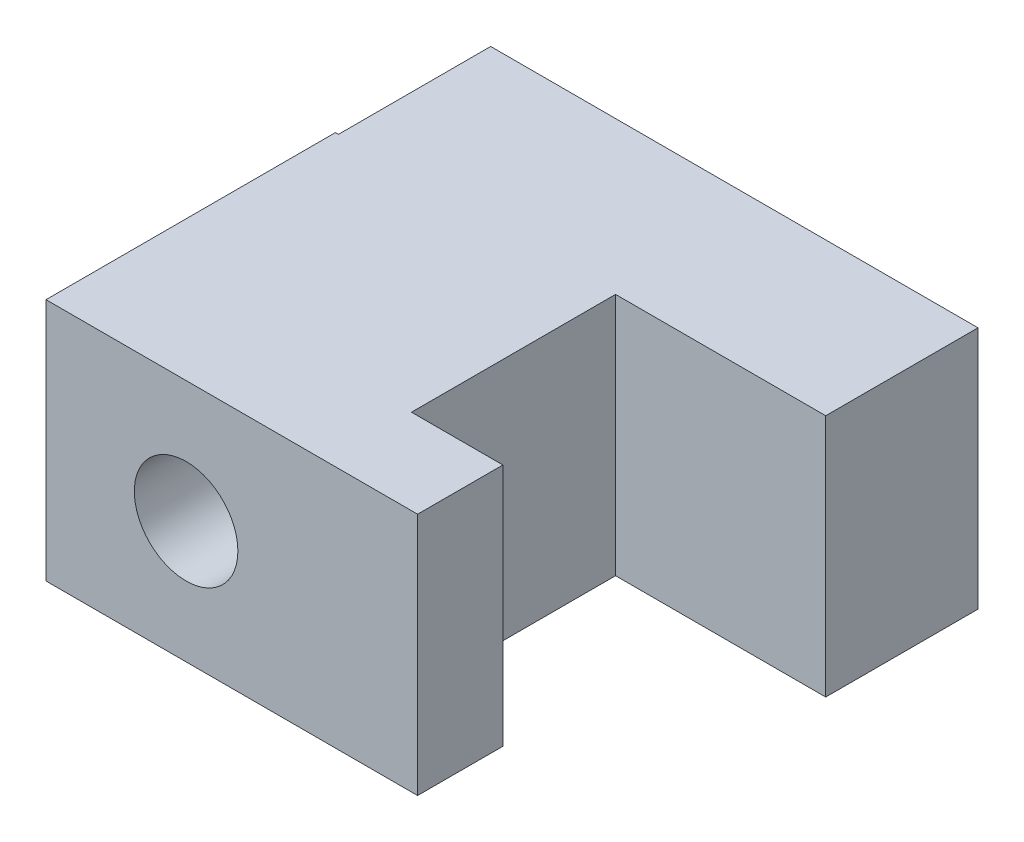
ISO-10303-21;
HEADER;
FILE_DESCRIPTION(('STEP AP214'),'2;1');
FILE_NAME('part.step','',(''),(''),'','','');
FILE_SCHEMA(('AUTOMOTIVE_DESIGN { 1 0 10303 214 1 1 1 1 }'));
ENDSEC;
DATA;
#1=APPLICATION_CONTEXT('core data for automotive mechanical design processes');
#2=APPLICATION_PROTOCOL_DEFINITION('international standard','automotive_design',2000,#1);
#3=PRODUCT_CONTEXT('',#1,'mechanical');
#4=PRODUCT('Part','Part','',(#3));
#5=PRODUCT_RELATED_PRODUCT_CATEGORY('part','',(#4));
#6=PRODUCT_DEFINITION_FORMATION('','',#4);
#7=PRODUCT_DEFINITION_CONTEXT('part definition',#1,'design');
#8=PRODUCT_DEFINITION('design','',#6,#7);
#9=PRODUCT_DEFINITION_SHAPE('','',#8);
#10=(LENGTH_UNIT() NAMED_UNIT(*) SI_UNIT(.MILLI.,.METRE.));
#11=(NAMED_UNIT(*) PLANE_ANGLE_UNIT() SI_UNIT($,.RADIAN.));
#12=(NAMED_UNIT(*) SI_UNIT($,.STERADIAN.) SOLID_ANGLE_UNIT());
#13=UNCERTAINTY_MEASURE_WITH_UNIT(LENGTH_MEASURE(1.E-05),#10,'distance_accuracy_value','');
#14=(GEOMETRIC_REPRESENTATION_CONTEXT(3) GLOBAL_UNCERTAINTY_ASSIGNED_CONTEXT((#13)) GLOBAL_UNIT_ASSIGNED_CONTEXT((#10,
#11,#12)) REPRESENTATION_CONTEXT('',''));
#15=CARTESIAN_POINT('',(0.,0.,0.));
#16=DIRECTION('',(0.,0.,1.));
#17=DIRECTION('',(1.,0.,0.));
#18=AXIS2_PLACEMENT_3D('',#15,#16,#17);
#19=CARTESIAN_POINT('',(-4.5,-4.,5.));
#20=DIRECTION('',(0.,1.,0.));
#21=DIRECTION('',(0.,0.,1.));
#22=AXIS2_PLACEMENT_3D('',#19,#20,#21);
#23=PLANE('',#22);
#24=DIRECTION('',(1.,0.,0.));
#25=VECTOR('',#24,1.);
#26=CARTESIAN_POINT('',(-4.5,-4.,0.));
#27=LINE('',#26,#25);
#28=CARTESIAN_POINT('',(-4.5,-4.,0.));
#29=VERTEX_POINT('',#28);
#30=CARTESIAN_POINT('',(11.5,-4.,0.));
#31=VERTEX_POINT('',#30);
#32=EDGE_CURVE('E179',#29,#31,#27,.T.);
#33=ORIENTED_EDGE('',*,*,#32,.T.);
#34=DIRECTION('',(0.,0.,-1.));
#35=VECTOR('',#34,1.);
#36=CARTESIAN_POINT('',(11.5,-4.,5.));
#37=LINE('',#36,#35);
#38=CARTESIAN_POINT('',(11.5,-4.,5.));
#39=VERTEX_POINT('',#38);
#40=EDGE_CURVE('E11',#39,#31,#37,.T.);
#41=ORIENTED_EDGE('',*,*,#40,.F.);
#42=DIRECTION('',(1.,0.,0.));
#43=VECTOR('',#42,1.);
#44=CARTESIAN_POINT('',(-4.5,-4.,5.));
#45=LINE('',#44,#43);
#46=CARTESIAN_POINT('',(4.6,-4.,5.));
#47=VERTEX_POINT('',#46);
#48=EDGE_CURVE('E90',#47,#39,#45,.T.);
#49=ORIENTED_EDGE('',*,*,#48,.F.);
#50=DIRECTION('',(0.,0.,-1.));
#51=VECTOR('',#50,1.);
#52=CARTESIAN_POINT('',(4.6,-4.,11.7));
#53=LINE('',#52,#51);
#54=CARTESIAN_POINT('',(4.6,-4.,11.7));
#55=VERTEX_POINT('',#54);
#56=EDGE_CURVE('E176',#55,#47,#53,.T.);
#57=ORIENTED_EDGE('',*,*,#56,.F.);
#58=DIRECTION('',(1.,0.,0.));
#59=VECTOR('',#58,1.);
#60=CARTESIAN_POINT('',(-4.6,-4.,11.7));
#61=LINE('',#60,#59);
#62=CARTESIAN_POINT('',(7.6,-4.,11.7));
#63=VERTEX_POINT('',#62);
#64=EDGE_CURVE('E151',#55,#63,#61,.T.);
#65=ORIENTED_EDGE('',*,*,#64,.T.);
#66=DIRECTION('',(0.,0.,-1.));
#67=VECTOR('',#66,1.);
#68=CARTESIAN_POINT('',(7.6,-4.,14.5));
#69=LINE('',#68,#67);
#70=CARTESIAN_POINT('',(7.6,-4.,14.5));
#71=VERTEX_POINT('',#70);
#72=EDGE_CURVE('E130',#71,#63,#69,.T.);
#73=ORIENTED_EDGE('',*,*,#72,.F.);
#74=DIRECTION('',(1.,0.,0.));
#75=VECTOR('',#74,1.);
#76=CARTESIAN_POINT('',(-4.6,-4.,14.5));
#77=LINE('',#76,#75);
#78=CARTESIAN_POINT('',(-4.6,-4.,14.5));
#79=VERTEX_POINT('',#78);
#80=EDGE_CURVE('E137',#79,#71,#77,.T.);
#81=ORIENTED_EDGE('',*,*,#80,.F.);
#82=DIRECTION('',(0.,0.,-1.));
#83=VECTOR('',#82,1.);
#84=CARTESIAN_POINT('',(-4.6,-4.,11.7));
#85=LINE('',#84,#83);
#86=CARTESIAN_POINT('',(-4.6,-4.,5.));
#87=VERTEX_POINT('',#86);
#88=EDGE_CURVE('E162',#79,#87,#85,.T.);
#89=ORIENTED_EDGE('',*,*,#88,.T.);
#90=DIRECTION('',(1.,0.,0.));
#91=VECTOR('',#90,1.);
#92=CARTESIAN_POINT('',(-4.6,-4.,5.));
#93=LINE('',#92,#91);
#94=CARTESIAN_POINT('',(-4.5,-4.,5.));
#95=VERTEX_POINT('',#94);
#96=EDGE_CURVE('E153',#87,#95,#93,.T.);
#97=ORIENTED_EDGE('',*,*,#96,.T.);
#98=DIRECTION('',(0.,0.,-1.));
#99=VECTOR('',#98,1.);
#100=CARTESIAN_POINT('',(-4.5,-4.,5.));
#101=LINE('',#100,#99);
#102=EDGE_CURVE('E67',#95,#29,#101,.T.);
#103=ORIENTED_EDGE('',*,*,#102,.T.);
#104=EDGE_LOOP('',(#33,#41,#49,#57,#65,#73,#81,#89,#97,#103));
#105=FACE_BOUND('',#104,.T.);
#106=ADVANCED_FACE('F43',(#105),#23,.F.);
#107=CARTESIAN_POINT('',(11.5,-4.,5.));
#108=DIRECTION('',(-1.,0.,0.));
#109=DIRECTION('',(0.,0.,1.));
#110=AXIS2_PLACEMENT_3D('',#107,#108,#109);
#111=PLANE('',#110);
#112=DIRECTION('',(0.,1.,0.));
#113=VECTOR('',#112,1.);
#114=CARTESIAN_POINT('',(11.5,-4.,0.));
#115=LINE('',#114,#113);
#116=CARTESIAN_POINT('',(11.5,4.,0.));
#117=VERTEX_POINT('',#116);
#118=EDGE_CURVE('E188',#31,#117,#115,.T.);
#119=ORIENTED_EDGE('',*,*,#118,.T.);
#120=DIRECTION('',(0.,0.,-1.));
#121=VECTOR('',#120,1.);
#122=CARTESIAN_POINT('',(11.5,4.,5.));
#123=LINE('',#122,#121);
#124=CARTESIAN_POINT('',(11.5,4.,5.));
#125=VERTEX_POINT('',#124);
#126=EDGE_CURVE('E51',#125,#117,#123,.T.);
#127=ORIENTED_EDGE('',*,*,#126,.F.);
#128=DIRECTION('',(0.,1.,0.));
#129=VECTOR('',#128,1.);
#130=CARTESIAN_POINT('',(11.5,-4.,5.));
#131=LINE('',#130,#129);
#132=EDGE_CURVE('E181',#39,#125,#131,.T.);
#133=ORIENTED_EDGE('',*,*,#132,.F.);
#134=ORIENTED_EDGE('',*,*,#40,.T.);
#135=EDGE_LOOP('',(#119,#127,#133,#134));
#136=FACE_BOUND('',#135,.T.);
#137=ADVANCED_FACE('F238',(#136),#111,.F.);
#138=CARTESIAN_POINT('',(11.5,4.,5.));
#139=DIRECTION('',(0.,-1.,0.));
#140=DIRECTION('',(0.,0.,-1.));
#141=AXIS2_PLACEMENT_3D('',#138,#139,#140);
#142=PLANE('',#141);
#143=DIRECTION('',(-1.,0.,0.));
#144=VECTOR('',#143,1.);
#145=CARTESIAN_POINT('',(11.5,4.,0.));
#146=LINE('',#145,#144);
#147=CARTESIAN_POINT('',(-4.5,4.,0.));
#148=VERTEX_POINT('',#147);
#149=EDGE_CURVE('E190',#117,#148,#146,.T.);
#150=ORIENTED_EDGE('',*,*,#149,.T.);
#151=DIRECTION('',(0.,0.,-1.));
#152=VECTOR('',#151,1.);
#153=CARTESIAN_POINT('',(-4.5,4.,5.));
#154=LINE('',#153,#152);
#155=CARTESIAN_POINT('',(-4.5,4.,5.));
#156=VERTEX_POINT('',#155);
#157=EDGE_CURVE('E194',#156,#148,#154,.T.);
#158=ORIENTED_EDGE('',*,*,#157,.F.);
#159=DIRECTION('',(-1.,0.,0.));
#160=VECTOR('',#159,1.);
#161=CARTESIAN_POINT('',(4.6,4.,5.));
#162=LINE('',#161,#160);
#163=CARTESIAN_POINT('',(-4.6,4.,5.));
#164=VERTEX_POINT('',#163);
#165=EDGE_CURVE('E166',#156,#164,#162,.T.);
#166=ORIENTED_EDGE('',*,*,#165,.T.);
#167=DIRECTION('',(0.,0.,-1.));
#168=VECTOR('',#167,1.);
#169=CARTESIAN_POINT('',(-4.6,4.,11.7));
#170=LINE('',#169,#168);
#171=CARTESIAN_POINT('',(-4.6,4.,14.5));
#172=VERTEX_POINT('',#171);
#173=EDGE_CURVE('E170',#172,#164,#170,.T.);
#174=ORIENTED_EDGE('',*,*,#173,.F.);
#175=DIRECTION('',(-1.,0.,0.));
#176=VECTOR('',#175,1.);
#177=CARTESIAN_POINT('',(7.6,4.,14.5));
#178=LINE('',#177,#176);
#179=CARTESIAN_POINT('',(7.6,4.,14.5));
#180=VERTEX_POINT('',#179);
#181=EDGE_CURVE('E136',#180,#172,#178,.T.);
#182=ORIENTED_EDGE('',*,*,#181,.F.);
#183=DIRECTION('',(0.,0.,-1.));
#184=VECTOR('',#183,1.);
#185=CARTESIAN_POINT('',(7.6,4.,14.5));
#186=LINE('',#185,#184);
#187=CARTESIAN_POINT('',(7.6,4.,11.7));
#188=VERTEX_POINT('',#187);
#189=EDGE_CURVE('E132',#180,#188,#186,.T.);
#190=ORIENTED_EDGE('',*,*,#189,.T.);
#191=DIRECTION('',(-1.,0.,0.));
#192=VECTOR('',#191,1.);
#193=CARTESIAN_POINT('',(7.6,4.,11.7));
#194=LINE('',#193,#192);
#195=CARTESIAN_POINT('',(4.6,4.,11.7));
#196=VERTEX_POINT('',#195);
#197=EDGE_CURVE('E146',#188,#196,#194,.T.);
#198=ORIENTED_EDGE('',*,*,#197,.T.);
#199=DIRECTION('',(0.,0.,-1.));
#200=VECTOR('',#199,1.);
#201=CARTESIAN_POINT('',(4.6,4.,11.7));
#202=LINE('',#201,#200);
#203=CARTESIAN_POINT('',(4.6,4.,5.));
#204=VERTEX_POINT('',#203);
#205=EDGE_CURVE('E173',#196,#204,#202,.T.);
#206=ORIENTED_EDGE('',*,*,#205,.T.);
#207=DIRECTION('',(-1.,0.,0.));
#208=VECTOR('',#207,1.);
#209=CARTESIAN_POINT('',(11.5,4.,5.));
#210=LINE('',#209,#208);
#211=EDGE_CURVE('E183',#125,#204,#210,.T.);
#212=ORIENTED_EDGE('',*,*,#211,.F.);
#213=ORIENTED_EDGE('',*,*,#126,.T.);
#214=EDGE_LOOP('',(#150,#158,#166,#174,#182,#190,#198,#206,#212,#213));
#215=FACE_BOUND('',#214,.T.);
#216=ADVANCED_FACE('F201',(#215),#142,.F.);
#217=CARTESIAN_POINT('',(-4.5,4.,5.));
#218=DIRECTION('',(1.,0.,0.));
#219=DIRECTION('',(0.,0.,-1.));
#220=AXIS2_PLACEMENT_3D('',#217,#218,#219);
#221=PLANE('',#220);
#222=DIRECTION('',(0.,-1.,0.));
#223=VECTOR('',#222,1.);
#224=CARTESIAN_POINT('',(-4.5,4.,0.));
#225=LINE('',#224,#223);
#226=EDGE_CURVE('E87',#148,#29,#225,.T.);
#227=ORIENTED_EDGE('',*,*,#226,.T.);
#228=ORIENTED_EDGE('',*,*,#102,.F.);
#229=DIRECTION('',(0.,-1.,0.));
#230=VECTOR('',#229,1.);
#231=CARTESIAN_POINT('',(-4.5,4.,5.));
#232=LINE('',#231,#230);
#233=EDGE_CURVE('E185',#156,#95,#232,.T.);
#234=ORIENTED_EDGE('',*,*,#233,.F.);
#235=ORIENTED_EDGE('',*,*,#157,.T.);
#236=EDGE_LOOP('',(#227,#228,#234,#235));
#237=FACE_BOUND('',#236,.T.);
#238=ADVANCED_FACE('F212',(#237),#221,.F.);
#239=CARTESIAN_POINT('',(0.,0.,5.));
#240=DIRECTION('',(0.,0.,1.));
#241=DIRECTION('',(1.,0.,0.));
#242=AXIS2_PLACEMENT_3D('',#239,#240,#241);
#243=PLANE('',#242);
#244=DIRECTION('',(0.,1.,0.));
#245=VECTOR('',#244,1.);
#246=CARTESIAN_POINT('',(4.6,-4.,5.));
#247=LINE('',#246,#245);
#248=EDGE_CURVE('E58',#47,#204,#247,.T.);
#249=ORIENTED_EDGE('',*,*,#248,.F.);
#250=ORIENTED_EDGE('',*,*,#48,.T.);
#251=ORIENTED_EDGE('',*,*,#132,.T.);
#252=ORIENTED_EDGE('',*,*,#211,.T.);
#253=EDGE_LOOP('',(#249,#250,#251,#252));
#254=FACE_BOUND('',#253,.T.);
#255=ADVANCED_FACE('F248',(#254),#243,.T.);
#256=CARTESIAN_POINT('',(0.,0.,0.));
#257=DIRECTION('',(0.,0.,1.));
#258=DIRECTION('',(1.,0.,0.));
#259=AXIS2_PLACEMENT_3D('',#256,#257,#258);
#260=PLANE('',#259);
#261=CARTESIAN_POINT('',(0.,0.,0.));
#262=DIRECTION('',(0.,0.,1.));
#263=DIRECTION('',(1.,0.,0.));
#264=AXIS2_PLACEMENT_3D('',#261,#262,#263);
#265=CIRCLE('',#264,1.7);
#266=CARTESIAN_POINT('',(1.7,0.,0.));
#267=VERTEX_POINT('',#266);
#268=EDGE_CURVE('E220',#267,#267,#265,.F.);
#269=ORIENTED_EDGE('',*,*,#268,.F.);
#270=EDGE_LOOP('',(#269));
#271=FACE_BOUND('',#270,.T.);
#272=ORIENTED_EDGE('',*,*,#32,.F.);
#273=ORIENTED_EDGE('',*,*,#226,.F.);
#274=ORIENTED_EDGE('',*,*,#149,.F.);
#275=ORIENTED_EDGE('',*,*,#118,.F.);
#276=EDGE_LOOP('',(#272,#273,#274,#275));
#277=FACE_BOUND('',#276,.T.);
#278=ADVANCED_FACE('F205',(#271,#277),#260,.F.);
#279=CARTESIAN_POINT('',(0.,0.,5.));
#280=DIRECTION('',(0.,0.,1.));
#281=DIRECTION('',(1.,0.,0.));
#282=AXIS2_PLACEMENT_3D('',#279,#280,#281);
#283=PLANE('',#282);
#284=ORIENTED_EDGE('',*,*,#165,.F.);
#285=ORIENTED_EDGE('',*,*,#233,.T.);
#286=ORIENTED_EDGE('',*,*,#96,.F.);
#287=DIRECTION('',(0.,-1.,0.));
#288=VECTOR('',#287,1.);
#289=CARTESIAN_POINT('',(-4.6,4.,5.));
#290=LINE('',#289,#288);
#291=EDGE_CURVE('E163',#164,#87,#290,.T.);
#292=ORIENTED_EDGE('',*,*,#291,.F.);
#293=EDGE_LOOP('',(#284,#285,#286,#292));
#294=FACE_BOUND('',#293,.T.);
#295=ADVANCED_FACE('F211',(#294),#283,.F.);
#296=CARTESIAN_POINT('',(4.6,-4.,11.7));
#297=DIRECTION('',(-1.,0.,0.));
#298=DIRECTION('',(0.,0.,1.));
#299=AXIS2_PLACEMENT_3D('',#296,#297,#298);
#300=PLANE('',#299);
#301=ORIENTED_EDGE('',*,*,#248,.T.);
#302=ORIENTED_EDGE('',*,*,#205,.F.);
#303=DIRECTION('',(0.,1.,0.));
#304=VECTOR('',#303,1.);
#305=CARTESIAN_POINT('',(4.6,-4.,11.7));
#306=LINE('',#305,#304);
#307=EDGE_CURVE('E160',#55,#196,#306,.T.);
#308=ORIENTED_EDGE('',*,*,#307,.F.);
#309=ORIENTED_EDGE('',*,*,#56,.T.);
#310=EDGE_LOOP('',(#301,#302,#308,#309));
#311=FACE_BOUND('',#310,.T.);
#312=ADVANCED_FACE('F226',(#311),#300,.F.);
#313=CARTESIAN_POINT('',(-4.6,4.,11.7));
#314=DIRECTION('',(1.,0.,0.));
#315=DIRECTION('',(0.,0.,-1.));
#316=AXIS2_PLACEMENT_3D('',#313,#314,#315);
#317=PLANE('',#316);
#318=ORIENTED_EDGE('',*,*,#291,.T.);
#319=ORIENTED_EDGE('',*,*,#88,.F.);
#320=DIRECTION('',(0.,-1.,0.));
#321=VECTOR('',#320,1.);
#322=CARTESIAN_POINT('',(-4.6,4.,14.5));
#323=LINE('',#322,#321);
#324=EDGE_CURVE('E143',#172,#79,#323,.T.);
#325=ORIENTED_EDGE('',*,*,#324,.F.);
#326=ORIENTED_EDGE('',*,*,#173,.T.);
#327=EDGE_LOOP('',(#318,#319,#325,#326));
#328=FACE_BOUND('',#327,.T.);
#329=ADVANCED_FACE('F214',(#328),#317,.F.);
#330=CARTESIAN_POINT('',(0.,0.,11.7));
#331=DIRECTION('',(0.,0.,1.));
#332=DIRECTION('',(1.,0.,0.));
#333=AXIS2_PLACEMENT_3D('',#330,#331,#332);
#334=PLANE('',#333);
#335=ORIENTED_EDGE('',*,*,#64,.F.);
#336=ORIENTED_EDGE('',*,*,#307,.T.);
#337=ORIENTED_EDGE('',*,*,#197,.F.);
#338=DIRECTION('',(0.,1.,0.));
#339=VECTOR('',#338,1.);
#340=CARTESIAN_POINT('',(7.6,-4.,11.7));
#341=LINE('',#340,#339);
#342=EDGE_CURVE('E219',#63,#188,#341,.T.);
#343=ORIENTED_EDGE('',*,*,#342,.F.);
#344=EDGE_LOOP('',(#335,#336,#337,#343));
#345=FACE_BOUND('',#344,.T.);
#346=ADVANCED_FACE('F224',(#345),#334,.F.);
#347=CARTESIAN_POINT('',(7.6,-4.,14.5));
#348=DIRECTION('',(-1.,0.,0.));
#349=DIRECTION('',(0.,0.,1.));
#350=AXIS2_PLACEMENT_3D('',#347,#348,#349);
#351=PLANE('',#350);
#352=ORIENTED_EDGE('',*,*,#342,.T.);
#353=ORIENTED_EDGE('',*,*,#189,.F.);
#354=DIRECTION('',(0.,1.,0.));
#355=VECTOR('',#354,1.);
#356=CARTESIAN_POINT('',(7.6,-4.,14.5));
#357=LINE('',#356,#355);
#358=EDGE_CURVE('E126',#71,#180,#357,.T.);
#359=ORIENTED_EDGE('',*,*,#358,.F.);
#360=ORIENTED_EDGE('',*,*,#72,.T.);
#361=EDGE_LOOP('',(#352,#353,#359,#360));
#362=FACE_BOUND('',#361,.T.);
#363=ADVANCED_FACE('F128',(#362),#351,.F.);
#364=CARTESIAN_POINT('',(0.,0.,14.5));
#365=DIRECTION('',(0.,0.,1.));
#366=DIRECTION('',(1.,0.,0.));
#367=AXIS2_PLACEMENT_3D('',#364,#365,#366);
#368=PLANE('',#367);
#369=CARTESIAN_POINT('',(0.,0.,14.5));
#370=DIRECTION('',(0.,0.,1.));
#371=DIRECTION('',(1.,0.,0.));
#372=AXIS2_PLACEMENT_3D('',#369,#370,#371);
#373=CIRCLE('',#372,1.7);
#374=CARTESIAN_POINT('',(1.7,0.,14.5));
#375=VERTEX_POINT('',#374);
#376=EDGE_CURVE('E46',#375,#375,#373,.F.);
#377=ORIENTED_EDGE('',*,*,#376,.T.);
#378=EDGE_LOOP('',(#377));
#379=FACE_BOUND('',#378,.T.);
#380=ORIENTED_EDGE('',*,*,#80,.T.);
#381=ORIENTED_EDGE('',*,*,#358,.T.);
#382=ORIENTED_EDGE('',*,*,#181,.T.);
#383=ORIENTED_EDGE('',*,*,#324,.T.);
#384=EDGE_LOOP('',(#380,#381,#382,#383));
#385=FACE_BOUND('',#384,.T.);
#386=ADVANCED_FACE('F141',(#379,#385),#368,.T.);
#387=CARTESIAN_POINT('',(0.,0.,16.));
#388=DIRECTION('',(0.,0.,-1.));
#389=DIRECTION('',(-1.,0.,0.));
#390=AXIS2_PLACEMENT_3D('',#387,#388,#389);
#391=CYLINDRICAL_SURFACE('',#390,1.7);
#392=ORIENTED_EDGE('',*,*,#376,.F.);
#393=EDGE_LOOP('',(#392));
#394=FACE_BOUND('',#393,.T.);
#395=ORIENTED_EDGE('',*,*,#268,.T.);
#396=EDGE_LOOP('',(#395));
#397=FACE_BOUND('',#396,.T.);
#398=ADVANCED_FACE('F310',(#394,#397),#391,.F.);
#399=CLOSED_SHELL('',(#106,#137,#216,#238,#255,#278,#295,#312,#329,#346,#363,#386,#398));
#400=MANIFOLD_SOLID_BREP('B2',#399);
#401=ADVANCED_BREP_SHAPE_REPRESENTATION('',(#18,#400),#14);
#402=SHAPE_DEFINITION_REPRESENTATION(#9,#401);
ENDSEC;
END-ISO-10303-21;
